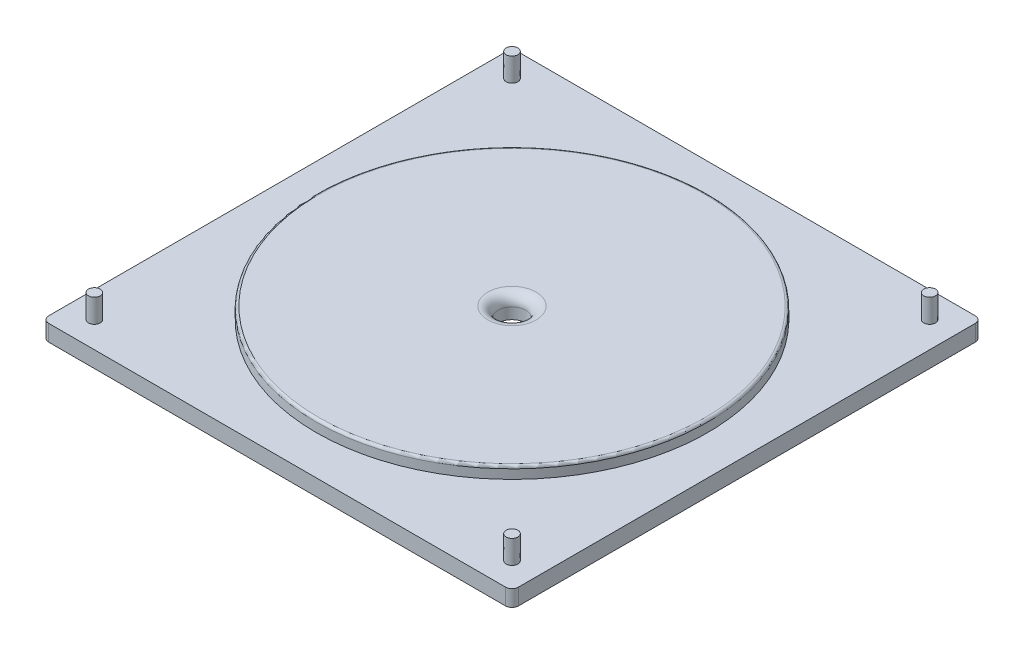
ISO-10303-21;
HEADER;
FILE_DESCRIPTION(('STEP AP214'),'2;1');
FILE_NAME('part.step','',(''),(''),'','','');
FILE_SCHEMA(('AUTOMOTIVE_DESIGN { 1 0 10303 214 1 1 1 1 }'));
ENDSEC;
DATA;
#1=APPLICATION_CONTEXT('core data for automotive mechanical design processes');
#2=APPLICATION_PROTOCOL_DEFINITION('international standard','automotive_design',2000,#1);
#3=PRODUCT_CONTEXT('',#1,'mechanical');
#4=PRODUCT('Part','Part','',(#3));
#5=PRODUCT_RELATED_PRODUCT_CATEGORY('part','',(#4));
#6=PRODUCT_DEFINITION_FORMATION('','',#4);
#7=PRODUCT_DEFINITION_CONTEXT('part definition',#1,'design');
#8=PRODUCT_DEFINITION('design','',#6,#7);
#9=PRODUCT_DEFINITION_SHAPE('','',#8);
#10=(LENGTH_UNIT() NAMED_UNIT(*) SI_UNIT(.MILLI.,.METRE.));
#11=(NAMED_UNIT(*) PLANE_ANGLE_UNIT() SI_UNIT($,.RADIAN.));
#12=(NAMED_UNIT(*) SI_UNIT($,.STERADIAN.) SOLID_ANGLE_UNIT());
#13=UNCERTAINTY_MEASURE_WITH_UNIT(LENGTH_MEASURE(1.E-05),#10,'distance_accuracy_value','');
#14=(GEOMETRIC_REPRESENTATION_CONTEXT(3) GLOBAL_UNCERTAINTY_ASSIGNED_CONTEXT((#13)) GLOBAL_UNIT_ASSIGNED_CONTEXT((#10,
#11,#12)) REPRESENTATION_CONTEXT('',''));
#15=CARTESIAN_POINT('',(0.,0.,0.));
#16=DIRECTION('',(0.,0.,1.));
#17=DIRECTION('',(1.,0.,0.));
#18=AXIS2_PLACEMENT_3D('',#15,#16,#17);
#19=CARTESIAN_POINT('',(45.0652983293557,0.,2.72792362768497));
#20=DIRECTION('',(0.,1.,0.));
#21=DIRECTION('',(0.,0.,1.));
#22=AXIS2_PLACEMENT_3D('',#19,#20,#21);
#23=CYLINDRICAL_SURFACE('',#22,2.667);
#24=CARTESIAN_POINT('',(45.0652983293557,3.429,2.72792362768497));
#25=DIRECTION('',(0.,1.,0.));
#26=DIRECTION('',(0.,0.,1.));
#27=AXIS2_PLACEMENT_3D('',#24,#25,#26);
#28=CIRCLE('',#27,2.667);
#29=CARTESIAN_POINT('',(45.0652983293557,3.429,5.39492362768496));
#30=VERTEX_POINT('',#29);
#31=EDGE_CURVE('E160',#30,#30,#28,.T.);
#32=ORIENTED_EDGE('',*,*,#31,.T.);
#33=EDGE_LOOP('',(#32));
#34=FACE_BOUND('',#33,.T.);
#35=CARTESIAN_POINT('',(45.0652983293557,1.27,2.72792362768497));
#36=DIRECTION('',(0.,-1.,0.));
#37=DIRECTION('',(0.,0.,-1.));
#38=AXIS2_PLACEMENT_3D('',#35,#36,#37);
#39=CIRCLE('',#38,2.667);
#40=CARTESIAN_POINT('',(45.0652983293557,1.27,0.0609236276849709));
#41=VERTEX_POINT('',#40);
#42=EDGE_CURVE('E208',#41,#41,#39,.F.);
#43=ORIENTED_EDGE('',*,*,#42,.F.);
#44=EDGE_LOOP('',(#43));
#45=FACE_BOUND('',#44,.T.);
#46=ADVANCED_FACE('F43',(#34,#45),#23,.F.);
#47=CARTESIAN_POINT('',(-0.654701670644339,3.175,-42.992076372315));
#48=DIRECTION('',(1.,0.,0.));
#49=DIRECTION('',(0.,0.,-1.));
#50=AXIS2_PLACEMENT_3D('',#47,#48,#49);
#51=PLANE('',#50);
#52=DIRECTION('',(0.,0.,1.));
#53=VECTOR('',#52,1.);
#54=CARTESIAN_POINT('',(-0.654701670644339,3.175,-42.992076372315));
#55=LINE('',#54,#53);
#56=CARTESIAN_POINT('',(-0.654701670644339,3.175,-41.722076372315));
#57=VERTEX_POINT('',#56);
#58=CARTESIAN_POINT('',(-0.654701670644312,3.175,47.177923627685));
#59=VERTEX_POINT('',#58);
#60=EDGE_CURVE('E132',#57,#59,#55,.T.);
#61=ORIENTED_EDGE('',*,*,#60,.F.);
#62=DIRECTION('',(0.,-1.,0.));
#63=VECTOR('',#62,1.);
#64=CARTESIAN_POINT('',(-0.654701670644339,3.175,-41.722076372315));
#65=LINE('',#64,#63);
#66=CARTESIAN_POINT('',(-0.654701670644339,0.,-41.722076372315));
#67=VERTEX_POINT('',#66);
#68=EDGE_CURVE('E115',#57,#67,#65,.T.);
#69=ORIENTED_EDGE('',*,*,#68,.T.);
#70=DIRECTION('',(0.,0.,1.));
#71=VECTOR('',#70,1.);
#72=CARTESIAN_POINT('',(-0.654701670644339,0.,-42.992076372315));
#73=LINE('',#72,#71);
#74=CARTESIAN_POINT('',(-0.654701670644312,0.,47.177923627685));
#75=VERTEX_POINT('',#74);
#76=EDGE_CURVE('E129',#67,#75,#73,.T.);
#77=ORIENTED_EDGE('',*,*,#76,.T.);
#78=DIRECTION('',(0.,-1.,0.));
#79=VECTOR('',#78,1.);
#80=CARTESIAN_POINT('',(-0.654701670644312,3.175,47.177923627685));
#81=LINE('',#80,#79);
#82=EDGE_CURVE('E135',#75,#59,#81,.F.);
#83=ORIENTED_EDGE('',*,*,#82,.T.);
#84=EDGE_LOOP('',(#61,#69,#77,#83));
#85=FACE_BOUND('',#84,.T.);
#86=ADVANCED_FACE('F128',(#85),#51,.F.);
#87=CARTESIAN_POINT('',(-0.654701670644312,3.175,48.447923627685));
#88=DIRECTION('',(0.,0.,-1.));
#89=DIRECTION('',(-1.,0.,0.));
#90=AXIS2_PLACEMENT_3D('',#87,#88,#89);
#91=PLANE('',#90);
#92=DIRECTION('',(1.,0.,0.));
#93=VECTOR('',#92,1.);
#94=CARTESIAN_POINT('',(-0.654701670644312,0.,48.447923627685));
#95=LINE('',#94,#93);
#96=CARTESIAN_POINT('',(0.615298329355688,0.,48.447923627685));
#97=VERTEX_POINT('',#96);
#98=CARTESIAN_POINT('',(89.5152983293557,0.,48.447923627685));
#99=VERTEX_POINT('',#98);
#100=EDGE_CURVE('E140',#97,#99,#95,.T.);
#101=ORIENTED_EDGE('',*,*,#100,.T.);
#102=DIRECTION('',(0.,-1.,0.));
#103=VECTOR('',#102,1.);
#104=CARTESIAN_POINT('',(89.5152983293557,3.175,48.447923627685));
#105=LINE('',#104,#103);
#106=CARTESIAN_POINT('',(89.5152983293557,3.175,48.447923627685));
#107=VERTEX_POINT('',#106);
#108=EDGE_CURVE('E204',#99,#107,#105,.F.);
#109=ORIENTED_EDGE('',*,*,#108,.T.);
#110=DIRECTION('',(1.,0.,0.));
#111=VECTOR('',#110,1.);
#112=CARTESIAN_POINT('',(-0.654701670644312,3.175,48.447923627685));
#113=LINE('',#112,#111);
#114=CARTESIAN_POINT('',(0.615298329355688,3.175,48.447923627685));
#115=VERTEX_POINT('',#114);
#116=EDGE_CURVE('E329',#115,#107,#113,.T.);
#117=ORIENTED_EDGE('',*,*,#116,.F.);
#118=DIRECTION('',(0.,-1.,0.));
#119=VECTOR('',#118,1.);
#120=CARTESIAN_POINT('',(0.615298329355688,3.175,48.447923627685));
#121=LINE('',#120,#119);
#122=EDGE_CURVE('E200',#115,#97,#121,.T.);
#123=ORIENTED_EDGE('',*,*,#122,.T.);
#124=EDGE_LOOP('',(#101,#109,#117,#123));
#125=FACE_BOUND('',#124,.T.);
#126=ADVANCED_FACE('F242',(#125),#91,.F.);
#127=CARTESIAN_POINT('',(90.7852983293557,3.175,-42.992076372315));
#128=DIRECTION('',(-1.,0.,0.));
#129=DIRECTION('',(0.,0.,1.));
#130=AXIS2_PLACEMENT_3D('',#127,#128,#129);
#131=PLANE('',#130);
#132=DIRECTION('',(0.,0.,-1.));
#133=VECTOR('',#132,1.);
#134=CARTESIAN_POINT('',(90.7852983293557,0.,-42.992076372315));
#135=LINE('',#134,#133);
#136=CARTESIAN_POINT('',(90.7852983293557,0.,47.177923627685));
#137=VERTEX_POINT('',#136);
#138=CARTESIAN_POINT('',(90.7852983293557,0.,-41.722076372315));
#139=VERTEX_POINT('',#138);
#140=EDGE_CURVE('E146',#137,#139,#135,.T.);
#141=ORIENTED_EDGE('',*,*,#140,.T.);
#142=DIRECTION('',(0.,-1.,0.));
#143=VECTOR('',#142,1.);
#144=CARTESIAN_POINT('',(90.7852983293557,3.175,-41.722076372315));
#145=LINE('',#144,#143);
#146=CARTESIAN_POINT('',(90.7852983293557,3.175,-41.722076372315));
#147=VERTEX_POINT('',#146);
#148=EDGE_CURVE('E59',#139,#147,#145,.F.);
#149=ORIENTED_EDGE('',*,*,#148,.T.);
#150=DIRECTION('',(0.,0.,-1.));
#151=VECTOR('',#150,1.);
#152=CARTESIAN_POINT('',(90.7852983293557,3.175,-42.992076372315));
#153=LINE('',#152,#151);
#154=CARTESIAN_POINT('',(90.7852983293557,3.175,47.177923627685));
#155=VERTEX_POINT('',#154);
#156=EDGE_CURVE('E332',#155,#147,#153,.T.);
#157=ORIENTED_EDGE('',*,*,#156,.F.);
#158=DIRECTION('',(0.,-1.,0.));
#159=VECTOR('',#158,1.);
#160=CARTESIAN_POINT('',(90.7852983293557,3.175,47.177923627685));
#161=LINE('',#160,#159);
#162=EDGE_CURVE('E194',#155,#137,#161,.T.);
#163=ORIENTED_EDGE('',*,*,#162,.T.);
#164=EDGE_LOOP('',(#141,#149,#157,#163));
#165=FACE_BOUND('',#164,.T.);
#166=ADVANCED_FACE('F297',(#165),#131,.F.);
#167=CARTESIAN_POINT('',(-0.654701670644339,3.175,-42.992076372315));
#168=DIRECTION('',(0.,0.,1.));
#169=DIRECTION('',(1.,0.,0.));
#170=AXIS2_PLACEMENT_3D('',#167,#168,#169);
#171=PLANE('',#170);
#172=DIRECTION('',(-1.,0.,0.));
#173=VECTOR('',#172,1.);
#174=CARTESIAN_POINT('',(-0.654701670644339,0.,-42.992076372315));
#175=LINE('',#174,#173);
#176=CARTESIAN_POINT('',(89.5152983293557,0.,-42.992076372315));
#177=VERTEX_POINT('',#176);
#178=CARTESIAN_POINT('',(0.615298329355661,0.,-42.992076372315));
#179=VERTEX_POINT('',#178);
#180=EDGE_CURVE('E157',#177,#179,#175,.T.);
#181=ORIENTED_EDGE('',*,*,#180,.T.);
#182=DIRECTION('',(0.,-1.,0.));
#183=VECTOR('',#182,1.);
#184=CARTESIAN_POINT('',(0.615298329355661,3.175,-42.992076372315));
#185=LINE('',#184,#183);
#186=CARTESIAN_POINT('',(0.615298329355661,3.175,-42.992076372315));
#187=VERTEX_POINT('',#186);
#188=EDGE_CURVE('E116',#179,#187,#185,.F.);
#189=ORIENTED_EDGE('',*,*,#188,.T.);
#190=DIRECTION('',(-1.,0.,0.));
#191=VECTOR('',#190,1.);
#192=CARTESIAN_POINT('',(-0.654701670644339,3.175,-42.992076372315));
#193=LINE('',#192,#191);
#194=CARTESIAN_POINT('',(89.5152983293557,3.175,-42.992076372315));
#195=VERTEX_POINT('',#194);
#196=EDGE_CURVE('E152',#195,#187,#193,.T.);
#197=ORIENTED_EDGE('',*,*,#196,.F.);
#198=DIRECTION('',(0.,-1.,0.));
#199=VECTOR('',#198,1.);
#200=CARTESIAN_POINT('',(89.5152983293557,3.175,-42.992076372315));
#201=LINE('',#200,#199);
#202=EDGE_CURVE('E122',#195,#177,#201,.T.);
#203=ORIENTED_EDGE('',*,*,#202,.T.);
#204=EDGE_LOOP('',(#181,#189,#197,#203));
#205=FACE_BOUND('',#204,.T.);
#206=ADVANCED_FACE('F290',(#205),#171,.F.);
#207=CARTESIAN_POINT('',(0.,3.175,0.));
#208=DIRECTION('',(0.,1.,0.));
#209=DIRECTION('',(0.,0.,1.));
#210=AXIS2_PLACEMENT_3D('',#207,#208,#209);
#211=PLANE('',#210);
#212=CARTESIAN_POINT('',(85.7052983293557,3.175,-37.912076372315));
#213=DIRECTION('',(0.,1.,0.));
#214=DIRECTION('',(0.,0.,1.));
#215=AXIS2_PLACEMENT_3D('',#212,#213,#214);
#216=CIRCLE('',#215,1.143);
#217=CARTESIAN_POINT('',(85.7052983293557,3.175,-36.769076372315));
#218=VERTEX_POINT('',#217);
#219=EDGE_CURVE('E357',#218,#218,#216,.T.);
#220=ORIENTED_EDGE('',*,*,#219,.F.);
#221=EDGE_LOOP('',(#220));
#222=FACE_BOUND('',#221,.T.);
#223=CARTESIAN_POINT('',(85.7052983293557,3.175,43.367923627685));
#224=DIRECTION('',(0.,1.,0.));
#225=DIRECTION('',(0.,0.,1.));
#226=AXIS2_PLACEMENT_3D('',#223,#224,#225);
#227=CIRCLE('',#226,1.143);
#228=CARTESIAN_POINT('',(85.7052983293557,3.175,44.510923627685));
#229=VERTEX_POINT('',#228);
#230=EDGE_CURVE('E349',#229,#229,#227,.T.);
#231=ORIENTED_EDGE('',*,*,#230,.F.);
#232=EDGE_LOOP('',(#231));
#233=FACE_BOUND('',#232,.T.);
#234=CARTESIAN_POINT('',(4.42529832935569,3.175,43.367923627685));
#235=DIRECTION('',(0.,1.,0.));
#236=DIRECTION('',(0.,0.,1.));
#237=AXIS2_PLACEMENT_3D('',#234,#235,#236);
#238=CIRCLE('',#237,1.143);
#239=CARTESIAN_POINT('',(4.42529832935569,3.175,44.510923627685));
#240=VERTEX_POINT('',#239);
#241=EDGE_CURVE('E343',#240,#240,#238,.T.);
#242=ORIENTED_EDGE('',*,*,#241,.F.);
#243=EDGE_LOOP('',(#242));
#244=FACE_BOUND('',#243,.T.);
#245=CARTESIAN_POINT('',(4.42529832935569,3.175,-37.912076372315));
#246=DIRECTION('',(0.,1.,0.));
#247=DIRECTION('',(0.,0.,1.));
#248=AXIS2_PLACEMENT_3D('',#245,#246,#247);
#249=CIRCLE('',#248,1.143);
#250=CARTESIAN_POINT('',(4.42529832935569,3.175,-36.769076372315));
#251=VERTEX_POINT('',#250);
#252=EDGE_CURVE('E149',#251,#251,#249,.T.);
#253=ORIENTED_EDGE('',*,*,#252,.F.);
#254=EDGE_LOOP('',(#253));
#255=FACE_BOUND('',#254,.T.);
#256=CARTESIAN_POINT('',(45.0652983293557,3.175,2.72792362768497));
#257=DIRECTION('',(0.,1.,0.));
#258=DIRECTION('',(0.,0.,1.));
#259=AXIS2_PLACEMENT_3D('',#256,#257,#258);
#260=CIRCLE('',#259,38.1);
#261=CARTESIAN_POINT('',(45.0652983293557,3.175,40.827923627685));
#262=VERTEX_POINT('',#261);
#263=EDGE_CURVE('E165',#262,#262,#260,.T.);
#264=ORIENTED_EDGE('',*,*,#263,.F.);
#265=EDGE_LOOP('',(#264));
#266=FACE_BOUND('',#265,.T.);
#267=ORIENTED_EDGE('',*,*,#196,.T.);
#268=CARTESIAN_POINT('',(0.615298329355661,3.175,-41.722076372315));
#269=DIRECTION('',(0.,1.,0.));
#270=DIRECTION('',(0.,0.,1.));
#271=AXIS2_PLACEMENT_3D('',#268,#269,#270);
#272=CIRCLE('',#271,1.27);
#273=EDGE_CURVE('E191',#187,#57,#272,.T.);
#274=ORIENTED_EDGE('',*,*,#273,.T.);
#275=ORIENTED_EDGE('',*,*,#60,.T.);
#276=CARTESIAN_POINT('',(0.615298329355688,3.175,47.177923627685));
#277=DIRECTION('',(0.,1.,0.));
#278=DIRECTION('',(0.,0.,1.));
#279=AXIS2_PLACEMENT_3D('',#276,#277,#278);
#280=CIRCLE('',#279,1.27);
#281=EDGE_CURVE('E183',#59,#115,#280,.T.);
#282=ORIENTED_EDGE('',*,*,#281,.T.);
#283=ORIENTED_EDGE('',*,*,#116,.T.);
#284=CARTESIAN_POINT('',(89.5152983293557,3.175,47.177923627685));
#285=DIRECTION('',(0.,1.,0.));
#286=DIRECTION('',(0.,0.,1.));
#287=AXIS2_PLACEMENT_3D('',#284,#285,#286);
#288=CIRCLE('',#287,1.27);
#289=EDGE_CURVE('E66',#107,#155,#288,.T.);
#290=ORIENTED_EDGE('',*,*,#289,.T.);
#291=ORIENTED_EDGE('',*,*,#156,.T.);
#292=CARTESIAN_POINT('',(89.5152983293557,3.175,-41.722076372315));
#293=DIRECTION('',(0.,1.,0.));
#294=DIRECTION('',(0.,0.,1.));
#295=AXIS2_PLACEMENT_3D('',#292,#293,#294);
#296=CIRCLE('',#295,1.27);
#297=EDGE_CURVE('E188',#147,#195,#296,.T.);
#298=ORIENTED_EDGE('',*,*,#297,.T.);
#299=EDGE_LOOP('',(#267,#274,#275,#282,#283,#290,#291,#298));
#300=FACE_BOUND('',#299,.T.);
#301=ADVANCED_FACE('F287',(#222,#233,#244,#255,#266,#300),#211,.T.);
#302=CARTESIAN_POINT('',(0.,0.,0.));
#303=DIRECTION('',(0.,1.,0.));
#304=DIRECTION('',(0.,0.,1.));
#305=AXIS2_PLACEMENT_3D('',#302,#303,#304);
#306=PLANE('',#305);
#307=CARTESIAN_POINT('',(45.0652983293557,0.,2.72792362768497));
#308=DIRECTION('',(0.,1.,0.));
#309=DIRECTION('',(0.,0.,1.));
#310=AXIS2_PLACEMENT_3D('',#307,#308,#309);
#311=CIRCLE('',#310,21.082);
#312=CARTESIAN_POINT('',(45.0652983293557,0.,23.809923627685));
#313=VERTEX_POINT('',#312);
#314=EDGE_CURVE('E217',#313,#313,#311,.T.);
#315=ORIENTED_EDGE('',*,*,#314,.T.);
#316=EDGE_LOOP('',(#315));
#317=FACE_BOUND('',#316,.T.);
#318=ORIENTED_EDGE('',*,*,#76,.F.);
#319=CARTESIAN_POINT('',(0.615298329355661,0.,-41.722076372315));
#320=DIRECTION('',(0.,1.,0.));
#321=DIRECTION('',(0.,0.,1.));
#322=AXIS2_PLACEMENT_3D('',#319,#320,#321);
#323=CIRCLE('',#322,1.27);
#324=EDGE_CURVE('E111',#67,#179,#323,.F.);
#325=ORIENTED_EDGE('',*,*,#324,.T.);
#326=ORIENTED_EDGE('',*,*,#180,.F.);
#327=CARTESIAN_POINT('',(89.5152983293557,0.,-41.722076372315));
#328=DIRECTION('',(0.,1.,0.));
#329=DIRECTION('',(0.,0.,1.));
#330=AXIS2_PLACEMENT_3D('',#327,#328,#329);
#331=CIRCLE('',#330,1.27);
#332=EDGE_CURVE('E123',#177,#139,#331,.F.);
#333=ORIENTED_EDGE('',*,*,#332,.T.);
#334=ORIENTED_EDGE('',*,*,#140,.F.);
#335=CARTESIAN_POINT('',(89.5152983293557,0.,47.177923627685));
#336=DIRECTION('',(0.,1.,0.));
#337=DIRECTION('',(0.,0.,1.));
#338=AXIS2_PLACEMENT_3D('',#335,#336,#337);
#339=CIRCLE('',#338,1.27);
#340=EDGE_CURVE('E173',#137,#99,#339,.F.);
#341=ORIENTED_EDGE('',*,*,#340,.T.);
#342=ORIENTED_EDGE('',*,*,#100,.F.);
#343=CARTESIAN_POINT('',(0.615298329355688,0.,47.177923627685));
#344=DIRECTION('',(0.,1.,0.));
#345=DIRECTION('',(0.,0.,1.));
#346=AXIS2_PLACEMENT_3D('',#343,#344,#345);
#347=CIRCLE('',#346,1.27);
#348=EDGE_CURVE('E134',#97,#75,#347,.F.);
#349=ORIENTED_EDGE('',*,*,#348,.T.);
#350=EDGE_LOOP('',(#318,#325,#326,#333,#334,#341,#342,#349));
#351=FACE_BOUND('',#350,.T.);
#352=ADVANCED_FACE('F137',(#317,#351),#306,.F.);
#353=CARTESIAN_POINT('',(45.0652983293557,5.461,2.72792362768497));
#354=DIRECTION('',(0.,-1.,0.));
#355=DIRECTION('',(0.,0.,-1.));
#356=AXIS2_PLACEMENT_3D('',#353,#354,#355);
#357=CYLINDRICAL_SURFACE('',#356,38.1);
#358=CARTESIAN_POINT('',(45.0652983293557,4.953,2.72792362768497));
#359=DIRECTION('',(0.,1.,0.));
#360=DIRECTION('',(0.,0.,1.));
#361=AXIS2_PLACEMENT_3D('',#358,#359,#360);
#362=CIRCLE('',#361,38.1);
#363=CARTESIAN_POINT('',(45.0652983293557,4.953,40.827923627685));
#364=VERTEX_POINT('',#363);
#365=EDGE_CURVE('E11',#364,#364,#362,.F.);
#366=ORIENTED_EDGE('',*,*,#365,.T.);
#367=EDGE_LOOP('',(#366));
#368=FACE_BOUND('',#367,.T.);
#369=ORIENTED_EDGE('',*,*,#263,.T.);
#370=EDGE_LOOP('',(#369));
#371=FACE_BOUND('',#370,.T.);
#372=ADVANCED_FACE('F283',(#368,#371),#357,.T.);
#373=CARTESIAN_POINT('',(45.0652983293557,5.461,2.72792362768497));
#374=DIRECTION('',(0.,1.,0.));
#375=DIRECTION('',(0.,0.,1.));
#376=AXIS2_PLACEMENT_3D('',#373,#374,#375);
#377=PLANE('',#376);
#378=CARTESIAN_POINT('',(45.0652983293557,5.461,2.72792362768497));
#379=DIRECTION('',(0.,1.,0.));
#380=DIRECTION('',(0.,0.,1.));
#381=AXIS2_PLACEMENT_3D('',#378,#379,#380);
#382=CIRCLE('',#381,37.592);
#383=CARTESIAN_POINT('',(45.0652983293557,5.461,40.319923627685));
#384=VERTEX_POINT('',#383);
#385=EDGE_CURVE('E52',#384,#384,#382,.T.);
#386=ORIENTED_EDGE('',*,*,#385,.T.);
#387=EDGE_LOOP('',(#386));
#388=FACE_BOUND('',#387,.T.);
#389=CARTESIAN_POINT('',(45.0652983293557,5.461,2.72792362768497));
#390=DIRECTION('',(0.,1.,0.));
#391=DIRECTION('',(0.,0.,1.));
#392=AXIS2_PLACEMENT_3D('',#389,#390,#391);
#393=CIRCLE('',#392,4.699);
#394=CARTESIAN_POINT('',(45.0652983293557,5.461,7.42692362768496));
#395=VERTEX_POINT('',#394);
#396=EDGE_CURVE('E164',#395,#395,#393,.F.);
#397=ORIENTED_EDGE('',*,*,#396,.T.);
#398=EDGE_LOOP('',(#397));
#399=FACE_BOUND('',#398,.T.);
#400=ADVANCED_FACE('F224',(#388,#399),#377,.T.);
#401=CARTESIAN_POINT('',(4.42529832935569,7.747,-37.912076372315));
#402=DIRECTION('',(0.,-1.,0.));
#403=DIRECTION('',(0.,0.,-1.));
#404=AXIS2_PLACEMENT_3D('',#401,#402,#403);
#405=CYLINDRICAL_SURFACE('',#404,1.143);
#406=CARTESIAN_POINT('',(4.42529832935569,7.747,-37.912076372315));
#407=DIRECTION('',(0.,1.,0.));
#408=DIRECTION('',(0.,0.,1.));
#409=AXIS2_PLACEMENT_3D('',#406,#407,#408);
#410=CIRCLE('',#409,1.143);
#411=CARTESIAN_POINT('',(4.42529832935569,7.747,-36.769076372315));
#412=VERTEX_POINT('',#411);
#413=EDGE_CURVE('E141',#412,#412,#410,.T.);
#414=ORIENTED_EDGE('',*,*,#413,.F.);
#415=EDGE_LOOP('',(#414));
#416=FACE_BOUND('',#415,.T.);
#417=ORIENTED_EDGE('',*,*,#252,.T.);
#418=EDGE_LOOP('',(#417));
#419=FACE_BOUND('',#418,.T.);
#420=ADVANCED_FACE('F276',(#416,#419),#405,.T.);
#421=CARTESIAN_POINT('',(4.42529832935569,7.747,-37.912076372315));
#422=DIRECTION('',(0.,1.,0.));
#423=DIRECTION('',(0.,0.,1.));
#424=AXIS2_PLACEMENT_3D('',#421,#422,#423);
#425=PLANE('',#424);
#426=ORIENTED_EDGE('',*,*,#413,.T.);
#427=EDGE_LOOP('',(#426));
#428=FACE_BOUND('',#427,.T.);
#429=ADVANCED_FACE('F269',(#428),#425,.T.);
#430=CARTESIAN_POINT('',(4.42529832935569,7.747,43.367923627685));
#431=DIRECTION('',(0.,-1.,0.));
#432=DIRECTION('',(0.,0.,-1.));
#433=AXIS2_PLACEMENT_3D('',#430,#431,#432);
#434=CYLINDRICAL_SURFACE('',#433,1.143);
#435=CARTESIAN_POINT('',(4.42529832935569,7.747,43.367923627685));
#436=DIRECTION('',(0.,1.,0.));
#437=DIRECTION('',(0.,0.,1.));
#438=AXIS2_PLACEMENT_3D('',#435,#436,#437);
#439=CIRCLE('',#438,1.143);
#440=CARTESIAN_POINT('',(4.42529832935569,7.747,44.510923627685));
#441=VERTEX_POINT('',#440);
#442=EDGE_CURVE('E345',#441,#441,#439,.T.);
#443=ORIENTED_EDGE('',*,*,#442,.F.);
#444=EDGE_LOOP('',(#443));
#445=FACE_BOUND('',#444,.T.);
#446=ORIENTED_EDGE('',*,*,#241,.T.);
#447=EDGE_LOOP('',(#446));
#448=FACE_BOUND('',#447,.T.);
#449=ADVANCED_FACE('F266',(#445,#448),#434,.T.);
#450=CARTESIAN_POINT('',(4.42529832935569,7.747,43.367923627685));
#451=DIRECTION('',(0.,1.,0.));
#452=DIRECTION('',(0.,0.,1.));
#453=AXIS2_PLACEMENT_3D('',#450,#451,#452);
#454=PLANE('',#453);
#455=ORIENTED_EDGE('',*,*,#442,.T.);
#456=EDGE_LOOP('',(#455));
#457=FACE_BOUND('',#456,.T.);
#458=ADVANCED_FACE('F261',(#457),#454,.T.);
#459=CARTESIAN_POINT('',(85.7052983293557,7.747,43.367923627685));
#460=DIRECTION('',(0.,-1.,0.));
#461=DIRECTION('',(0.,0.,-1.));
#462=AXIS2_PLACEMENT_3D('',#459,#460,#461);
#463=CYLINDRICAL_SURFACE('',#462,1.143);
#464=CARTESIAN_POINT('',(85.7052983293557,7.747,43.367923627685));
#465=DIRECTION('',(0.,1.,0.));
#466=DIRECTION('',(0.,0.,1.));
#467=AXIS2_PLACEMENT_3D('',#464,#465,#466);
#468=CIRCLE('',#467,1.143);
#469=CARTESIAN_POINT('',(85.7052983293557,7.747,44.510923627685));
#470=VERTEX_POINT('',#469);
#471=EDGE_CURVE('E353',#470,#470,#468,.T.);
#472=ORIENTED_EDGE('',*,*,#471,.F.);
#473=EDGE_LOOP('',(#472));
#474=FACE_BOUND('',#473,.T.);
#475=ORIENTED_EDGE('',*,*,#230,.T.);
#476=EDGE_LOOP('',(#475));
#477=FACE_BOUND('',#476,.T.);
#478=ADVANCED_FACE('F258',(#474,#477),#463,.T.);
#479=CARTESIAN_POINT('',(85.7052983293557,7.747,43.367923627685));
#480=DIRECTION('',(0.,1.,0.));
#481=DIRECTION('',(0.,0.,1.));
#482=AXIS2_PLACEMENT_3D('',#479,#480,#481);
#483=PLANE('',#482);
#484=ORIENTED_EDGE('',*,*,#471,.T.);
#485=EDGE_LOOP('',(#484));
#486=FACE_BOUND('',#485,.T.);
#487=ADVANCED_FACE('F252',(#486),#483,.T.);
#488=CARTESIAN_POINT('',(85.7052983293557,7.747,-37.912076372315));
#489=DIRECTION('',(0.,-1.,0.));
#490=DIRECTION('',(0.,0.,-1.));
#491=AXIS2_PLACEMENT_3D('',#488,#489,#490);
#492=CYLINDRICAL_SURFACE('',#491,1.143);
#493=CARTESIAN_POINT('',(85.7052983293557,7.747,-37.912076372315));
#494=DIRECTION('',(0.,1.,0.));
#495=DIRECTION('',(0.,0.,1.));
#496=AXIS2_PLACEMENT_3D('',#493,#494,#495);
#497=CIRCLE('',#496,1.143);
#498=CARTESIAN_POINT('',(85.7052983293557,7.747,-36.769076372315));
#499=VERTEX_POINT('',#498);
#500=EDGE_CURVE('E212',#499,#499,#497,.T.);
#501=ORIENTED_EDGE('',*,*,#500,.F.);
#502=EDGE_LOOP('',(#501));
#503=FACE_BOUND('',#502,.T.);
#504=ORIENTED_EDGE('',*,*,#219,.T.);
#505=EDGE_LOOP('',(#504));
#506=FACE_BOUND('',#505,.T.);
#507=ADVANCED_FACE('F248',(#503,#506),#492,.T.);
#508=CARTESIAN_POINT('',(85.7052983293557,7.747,-37.912076372315));
#509=DIRECTION('',(0.,1.,0.));
#510=DIRECTION('',(0.,0.,1.));
#511=AXIS2_PLACEMENT_3D('',#508,#509,#510);
#512=PLANE('',#511);
#513=ORIENTED_EDGE('',*,*,#500,.T.);
#514=EDGE_LOOP('',(#513));
#515=FACE_BOUND('',#514,.T.);
#516=ADVANCED_FACE('F251',(#515),#512,.T.);
#517=CARTESIAN_POINT('',(45.0652983293557,3.429,2.72792362768497));
#518=DIRECTION('',(0.,1.,0.));
#519=DIRECTION('',(0.,0.,1.));
#520=AXIS2_PLACEMENT_3D('',#517,#518,#519);
#521=TOROIDAL_SURFACE('',#520,4.699,2.032);
#522=ORIENTED_EDGE('',*,*,#396,.F.);
#523=EDGE_LOOP('',(#522));
#524=FACE_BOUND('',#523,.T.);
#525=ORIENTED_EDGE('',*,*,#31,.F.);
#526=EDGE_LOOP('',(#525));
#527=FACE_BOUND('',#526,.T.);
#528=ADVANCED_FACE('F256',(#524,#527),#521,.T.);
#529=CARTESIAN_POINT('',(0.615298329355661,3.175,-41.722076372315));
#530=DIRECTION('',(0.,-1.,0.));
#531=DIRECTION('',(0.,0.,-1.));
#532=AXIS2_PLACEMENT_3D('',#529,#530,#531);
#533=CYLINDRICAL_SURFACE('',#532,1.27);
#534=ORIENTED_EDGE('',*,*,#273,.F.);
#535=ORIENTED_EDGE('',*,*,#188,.F.);
#536=ORIENTED_EDGE('',*,*,#324,.F.);
#537=ORIENTED_EDGE('',*,*,#68,.F.);
#538=EDGE_LOOP('',(#534,#535,#536,#537));
#539=FACE_BOUND('',#538,.T.);
#540=ADVANCED_FACE('F114',(#539),#533,.T.);
#541=CARTESIAN_POINT('',(89.5152983293557,3.175,-41.722076372315));
#542=DIRECTION('',(0.,-1.,0.));
#543=DIRECTION('',(0.,0.,-1.));
#544=AXIS2_PLACEMENT_3D('',#541,#542,#543);
#545=CYLINDRICAL_SURFACE('',#544,1.27);
#546=ORIENTED_EDGE('',*,*,#297,.F.);
#547=ORIENTED_EDGE('',*,*,#148,.F.);
#548=ORIENTED_EDGE('',*,*,#332,.F.);
#549=ORIENTED_EDGE('',*,*,#202,.F.);
#550=EDGE_LOOP('',(#546,#547,#548,#549));
#551=FACE_BOUND('',#550,.T.);
#552=ADVANCED_FACE('F309',(#551),#545,.T.);
#553=CARTESIAN_POINT('',(89.5152983293557,3.175,47.177923627685));
#554=DIRECTION('',(0.,-1.,0.));
#555=DIRECTION('',(0.,0.,-1.));
#556=AXIS2_PLACEMENT_3D('',#553,#554,#555);
#557=CYLINDRICAL_SURFACE('',#556,1.27);
#558=ORIENTED_EDGE('',*,*,#289,.F.);
#559=ORIENTED_EDGE('',*,*,#108,.F.);
#560=ORIENTED_EDGE('',*,*,#340,.F.);
#561=ORIENTED_EDGE('',*,*,#162,.F.);
#562=EDGE_LOOP('',(#558,#559,#560,#561));
#563=FACE_BOUND('',#562,.T.);
#564=ADVANCED_FACE('F312',(#563),#557,.T.);
#565=CARTESIAN_POINT('',(0.615298329355688,3.175,47.177923627685));
#566=DIRECTION('',(0.,-1.,0.));
#567=DIRECTION('',(0.,0.,-1.));
#568=AXIS2_PLACEMENT_3D('',#565,#566,#567);
#569=CYLINDRICAL_SURFACE('',#568,1.27);
#570=ORIENTED_EDGE('',*,*,#281,.F.);
#571=ORIENTED_EDGE('',*,*,#82,.F.);
#572=ORIENTED_EDGE('',*,*,#348,.F.);
#573=ORIENTED_EDGE('',*,*,#122,.F.);
#574=EDGE_LOOP('',(#570,#571,#572,#573));
#575=FACE_BOUND('',#574,.T.);
#576=ADVANCED_FACE('F316',(#575),#569,.T.);
#577=CARTESIAN_POINT('',(45.0652983293557,1.27,2.72792362768497));
#578=DIRECTION('',(0.,-1.,0.));
#579=DIRECTION('',(0.,0.,-1.));
#580=AXIS2_PLACEMENT_3D('',#577,#578,#579);
#581=PLANE('',#580);
#582=CARTESIAN_POINT('',(45.0652983293557,1.27,2.72792362768497));
#583=DIRECTION('',(0.,-1.,0.));
#584=DIRECTION('',(0.,0.,-1.));
#585=AXIS2_PLACEMENT_3D('',#582,#583,#584);
#586=CIRCLE('',#585,20.32);
#587=CARTESIAN_POINT('',(45.0652983293557,1.27,-17.592076372315));
#588=VERTEX_POINT('',#587);
#589=EDGE_CURVE('E213',#588,#588,#586,.T.);
#590=ORIENTED_EDGE('',*,*,#589,.T.);
#591=EDGE_LOOP('',(#590));
#592=FACE_BOUND('',#591,.T.);
#593=ORIENTED_EDGE('',*,*,#42,.T.);
#594=EDGE_LOOP('',(#593));
#595=FACE_BOUND('',#594,.T.);
#596=ADVANCED_FACE('F319',(#592,#595),#581,.T.);
#597=CARTESIAN_POINT('',(45.0652983293557,1.27,2.72792362768497));
#598=DIRECTION('',(0.,-1.,0.));
#599=DIRECTION('',(0.,0.,-1.));
#600=AXIS2_PLACEMENT_3D('',#597,#598,#599);
#601=CYLINDRICAL_SURFACE('',#600,20.32);
#602=CARTESIAN_POINT('',(45.0652983293557,0.762,2.72792362768497));
#603=DIRECTION('',(0.,1.,0.));
#604=DIRECTION('',(0.,0.,1.));
#605=AXIS2_PLACEMENT_3D('',#602,#603,#604);
#606=CIRCLE('',#605,20.32);
#607=CARTESIAN_POINT('',(45.0652983293557,0.762,23.047923627685));
#608=VERTEX_POINT('',#607);
#609=EDGE_CURVE('E207',#608,#608,#606,.F.);
#610=ORIENTED_EDGE('',*,*,#609,.T.);
#611=EDGE_LOOP('',(#610));
#612=FACE_BOUND('',#611,.T.);
#613=ORIENTED_EDGE('',*,*,#589,.F.);
#614=EDGE_LOOP('',(#613));
#615=FACE_BOUND('',#614,.T.);
#616=ADVANCED_FACE('F233',(#612,#615),#601,.F.);
#617=CARTESIAN_POINT('',(45.0652983293557,0.762,2.72792362768497));
#618=DIRECTION('',(0.,1.,0.));
#619=DIRECTION('',(0.,0.,1.));
#620=AXIS2_PLACEMENT_3D('',#617,#618,#619);
#621=TOROIDAL_SURFACE('',#620,21.082,0.762);
#622=ORIENTED_EDGE('',*,*,#314,.F.);
#623=EDGE_LOOP('',(#622));
#624=FACE_BOUND('',#623,.T.);
#625=ORIENTED_EDGE('',*,*,#609,.F.);
#626=EDGE_LOOP('',(#625));
#627=FACE_BOUND('',#626,.T.);
#628=ADVANCED_FACE('F228',(#624,#627),#621,.T.);
#629=CARTESIAN_POINT('',(45.0652983293557,4.953,2.72792362768497));
#630=DIRECTION('',(0.,1.,0.));
#631=DIRECTION('',(0.,0.,1.));
#632=AXIS2_PLACEMENT_3D('',#629,#630,#631);
#633=TOROIDAL_SURFACE('',#632,37.592,0.508);
#634=ORIENTED_EDGE('',*,*,#365,.F.);
#635=EDGE_LOOP('',(#634));
#636=FACE_BOUND('',#635,.T.);
#637=ORIENTED_EDGE('',*,*,#385,.F.);
#638=EDGE_LOOP('',(#637));
#639=FACE_BOUND('',#638,.T.);
#640=ADVANCED_FACE('F45',(#636,#639),#633,.T.);
#641=CLOSED_SHELL('',(#46,#86,#126,#166,#206,#301,#352,#372,#400,#420,#429,#449,#458,#478,#487,
#507,#516,#528,#540,#552,#564,#576,#596,#616,#628,#640));
#642=MANIFOLD_SOLID_BREP('B2',#641);
#643=ADVANCED_BREP_SHAPE_REPRESENTATION('',(#18,#642),#14);
#644=SHAPE_DEFINITION_REPRESENTATION(#9,#643);
ENDSEC;
END-ISO-10303-21;
